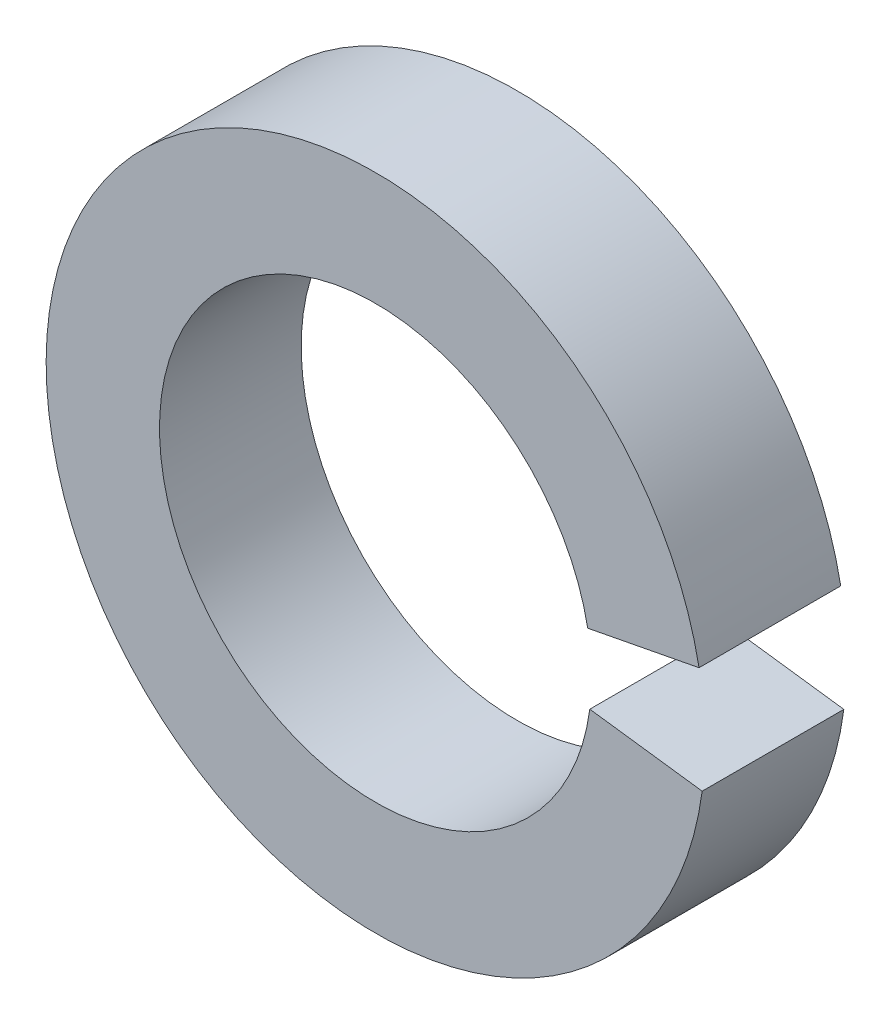
ISO-10303-21;
HEADER;
FILE_DESCRIPTION(('STEP AP214'),'2;1');
FILE_NAME('part.step','',(''),(''),'','','');
FILE_SCHEMA(('AUTOMOTIVE_DESIGN { 1 0 10303 214 1 1 1 1 }'));
ENDSEC;
DATA;
#1=APPLICATION_CONTEXT('core data for automotive mechanical design processes');
#2=APPLICATION_PROTOCOL_DEFINITION('international standard','automotive_design',2000,#1);
#3=PRODUCT_CONTEXT('',#1,'mechanical');
#4=PRODUCT('Part','Part','',(#3));
#5=PRODUCT_RELATED_PRODUCT_CATEGORY('part','',(#4));
#6=PRODUCT_DEFINITION_FORMATION('','',#4);
#7=PRODUCT_DEFINITION_CONTEXT('part definition',#1,'design');
#8=PRODUCT_DEFINITION('design','',#6,#7);
#9=PRODUCT_DEFINITION_SHAPE('','',#8);
#10=(LENGTH_UNIT() NAMED_UNIT(*) SI_UNIT(.MILLI.,.METRE.));
#11=(NAMED_UNIT(*) PLANE_ANGLE_UNIT() SI_UNIT($,.RADIAN.));
#12=(NAMED_UNIT(*) SI_UNIT($,.STERADIAN.) SOLID_ANGLE_UNIT());
#13=UNCERTAINTY_MEASURE_WITH_UNIT(LENGTH_MEASURE(1.E-05),#10,'distance_accuracy_value','');
#14=(GEOMETRIC_REPRESENTATION_CONTEXT(3) GLOBAL_UNCERTAINTY_ASSIGNED_CONTEXT((#13)) GLOBAL_UNIT_ASSIGNED_CONTEXT((#10,
#11,#12)) REPRESENTATION_CONTEXT('',''));
#15=CARTESIAN_POINT('',(0.,0.,0.));
#16=DIRECTION('',(0.,0.,1.));
#17=DIRECTION('',(1.,0.,0.));
#18=AXIS2_PLACEMENT_3D('',#15,#16,#17);
#19=CARTESIAN_POINT('',(0.,0.,2.));
#20=DIRECTION('',(0.,0.,-1.));
#21=DIRECTION('',(-1.,0.,0.));
#22=AXIS2_PLACEMENT_3D('',#19,#20,#21);
#23=CYLINDRICAL_SURFACE('',#22,3.05);
#24=CARTESIAN_POINT('',(0.,0.,0.));
#25=DIRECTION('',(0.,0.,-1.));
#26=DIRECTION('',(1.,0.,0.));
#27=AXIS2_PLACEMENT_3D('',#24,#25,#26);
#28=CIRCLE('',#27,3.05);
#29=CARTESIAN_POINT('',(3.02384323329183,-0.398587632115206,0.));
#30=VERTEX_POINT('',#29);
#31=CARTESIAN_POINT('',(2.99498014845336,0.576709554602892,0.));
#32=VERTEX_POINT('',#31);
#33=EDGE_CURVE('E97',#30,#32,#28,.T.);
#34=ORIENTED_EDGE('',*,*,#33,.T.);
#35=DIRECTION('',(0.,0.,-1.));
#36=VECTOR('',#35,1.);
#37=CARTESIAN_POINT('',(2.99498014845336,0.576709554602892,2.));
#38=LINE('',#37,#36);
#39=CARTESIAN_POINT('',(2.99498014845336,0.576709554602892,2.));
#40=VERTEX_POINT('',#39);
#41=EDGE_CURVE('E11',#40,#32,#38,.T.);
#42=ORIENTED_EDGE('',*,*,#41,.F.);
#43=CARTESIAN_POINT('',(0.,0.,2.));
#44=DIRECTION('',(0.,0.,-1.));
#45=DIRECTION('',(1.,0.,0.));
#46=AXIS2_PLACEMENT_3D('',#43,#44,#45);
#47=CIRCLE('',#46,3.05);
#48=CARTESIAN_POINT('',(3.02384323329183,-0.398587632115206,2.));
#49=VERTEX_POINT('',#48);
#50=EDGE_CURVE('E85',#49,#40,#47,.T.);
#51=ORIENTED_EDGE('',*,*,#50,.F.);
#52=DIRECTION('',(0.,0.,-1.));
#53=VECTOR('',#52,1.);
#54=CARTESIAN_POINT('',(3.02384323329183,-0.398587632115206,2.));
#55=LINE('',#54,#53);
#56=EDGE_CURVE('E93',#49,#30,#55,.T.);
#57=ORIENTED_EDGE('',*,*,#56,.T.);
#58=EDGE_LOOP('',(#34,#42,#51,#57));
#59=FACE_BOUND('',#58,.T.);
#60=ADVANCED_FACE('F34',(#59),#23,.F.);
#61=CARTESIAN_POINT('',(2.99498014845336,0.576709554602892,2.));
#62=DIRECTION('',(-0.189085099869801,0.981960704410939,0.));
#63=DIRECTION('',(-0.981960704410939,-0.189085099869801,0.));
#64=AXIS2_PLACEMENT_3D('',#61,#62,#63);
#65=PLANE('',#64);
#66=DIRECTION('',(0.981960704410939,0.189085099869801,0.));
#67=VECTOR('',#66,1.);
#68=CARTESIAN_POINT('',(2.99498014845336,0.576709554602892,0.));
#69=LINE('',#68,#67);
#70=CARTESIAN_POINT('',(4.56611727551087,0.879245714394574,0.));
#71=VERTEX_POINT('',#70);
#72=EDGE_CURVE('E89',#32,#71,#69,.T.);
#73=ORIENTED_EDGE('',*,*,#72,.T.);
#74=DIRECTION('',(0.,0.,-1.));
#75=VECTOR('',#74,1.);
#76=CARTESIAN_POINT('',(4.56611727551087,0.879245714394574,2.));
#77=LINE('',#76,#75);
#78=CARTESIAN_POINT('',(4.56611727551087,0.879245714394574,2.));
#79=VERTEX_POINT('',#78);
#80=EDGE_CURVE('E42',#79,#71,#77,.T.);
#81=ORIENTED_EDGE('',*,*,#80,.F.);
#82=DIRECTION('',(0.981960704410939,0.189085099869801,0.));
#83=VECTOR('',#82,1.);
#84=CARTESIAN_POINT('',(2.99498014845336,0.576709554602892,2.));
#85=LINE('',#84,#83);
#86=EDGE_CURVE('E80',#40,#79,#85,.T.);
#87=ORIENTED_EDGE('',*,*,#86,.F.);
#88=ORIENTED_EDGE('',*,*,#41,.T.);
#89=EDGE_LOOP('',(#73,#81,#87,#88));
#90=FACE_BOUND('',#89,.T.);
#91=ADVANCED_FACE('F88',(#90),#65,.F.);
#92=CARTESIAN_POINT('',(0.,0.,2.));
#93=DIRECTION('',(0.,0.,-1.));
#94=DIRECTION('',(-1.,0.,0.));
#95=AXIS2_PLACEMENT_3D('',#92,#93,#94);
#96=CYLINDRICAL_SURFACE('',#95,4.65);
#97=CARTESIAN_POINT('',(0.,0.,0.));
#98=DIRECTION('',(0.,0.,1.));
#99=DIRECTION('',(1.,0.,0.));
#100=AXIS2_PLACEMENT_3D('',#97,#98,#99);
#101=CIRCLE('',#100,4.65);
#102=CARTESIAN_POINT('',(4.6101216507564,-0.607682783388757,0.));
#103=VERTEX_POINT('',#102);
#104=EDGE_CURVE('E67',#71,#103,#101,.T.);
#105=ORIENTED_EDGE('',*,*,#104,.T.);
#106=DIRECTION('',(0.,0.,-1.));
#107=VECTOR('',#106,1.);
#108=CARTESIAN_POINT('',(4.6101216507564,-0.607682783388757,2.));
#109=LINE('',#108,#107);
#110=CARTESIAN_POINT('',(4.6101216507564,-0.607682783388757,2.));
#111=VERTEX_POINT('',#110);
#112=EDGE_CURVE('E90',#111,#103,#109,.T.);
#113=ORIENTED_EDGE('',*,*,#112,.F.);
#114=CARTESIAN_POINT('',(0.,0.,2.));
#115=DIRECTION('',(0.,0.,1.));
#116=DIRECTION('',(1.,0.,0.));
#117=AXIS2_PLACEMENT_3D('',#114,#115,#116);
#118=CIRCLE('',#117,4.65);
#119=EDGE_CURVE('E83',#79,#111,#118,.T.);
#120=ORIENTED_EDGE('',*,*,#119,.F.);
#121=ORIENTED_EDGE('',*,*,#80,.T.);
#122=EDGE_LOOP('',(#105,#113,#120,#121));
#123=FACE_BOUND('',#122,.T.);
#124=ADVANCED_FACE('F91',(#123),#96,.T.);
#125=CARTESIAN_POINT('',(3.02384323329183,-0.398587632115206,2.));
#126=DIRECTION('',(-0.130684469545969,-0.991424010915354,0.));
#127=DIRECTION('',(0.991424010915354,-0.130684469545969,0.));
#128=AXIS2_PLACEMENT_3D('',#125,#126,#127);
#129=PLANE('',#128);
#130=DIRECTION('',(-0.991424010915354,0.130684469545969,0.));
#131=VECTOR('',#130,1.);
#132=CARTESIAN_POINT('',(3.02384323329183,-0.398587632115206,0.));
#133=LINE('',#132,#131);
#134=EDGE_CURVE('E73',#103,#30,#133,.T.);
#135=ORIENTED_EDGE('',*,*,#134,.T.);
#136=ORIENTED_EDGE('',*,*,#56,.F.);
#137=DIRECTION('',(-0.991424010915354,0.130684469545969,0.));
#138=VECTOR('',#137,1.);
#139=CARTESIAN_POINT('',(3.02384323329183,-0.398587632115206,2.));
#140=LINE('',#139,#138);
#141=EDGE_CURVE('E50',#111,#49,#140,.T.);
#142=ORIENTED_EDGE('',*,*,#141,.F.);
#143=ORIENTED_EDGE('',*,*,#112,.T.);
#144=EDGE_LOOP('',(#135,#136,#142,#143));
#145=FACE_BOUND('',#144,.T.);
#146=ADVANCED_FACE('F104',(#145),#129,.F.);
#147=CARTESIAN_POINT('',(0.,0.,2.));
#148=DIRECTION('',(0.,0.,1.));
#149=DIRECTION('',(1.,0.,0.));
#150=AXIS2_PLACEMENT_3D('',#147,#148,#149);
#151=PLANE('',#150);
#152=ORIENTED_EDGE('',*,*,#50,.T.);
#153=ORIENTED_EDGE('',*,*,#86,.T.);
#154=ORIENTED_EDGE('',*,*,#119,.T.);
#155=ORIENTED_EDGE('',*,*,#141,.T.);
#156=EDGE_LOOP('',(#152,#153,#154,#155));
#157=FACE_BOUND('',#156,.T.);
#158=ADVANCED_FACE('F81',(#157),#151,.T.);
#159=CARTESIAN_POINT('',(0.,0.,0.));
#160=DIRECTION('',(0.,0.,1.));
#161=DIRECTION('',(1.,0.,0.));
#162=AXIS2_PLACEMENT_3D('',#159,#160,#161);
#163=PLANE('',#162);
#164=ORIENTED_EDGE('',*,*,#33,.F.);
#165=ORIENTED_EDGE('',*,*,#134,.F.);
#166=ORIENTED_EDGE('',*,*,#104,.F.);
#167=ORIENTED_EDGE('',*,*,#72,.F.);
#168=EDGE_LOOP('',(#164,#165,#166,#167));
#169=FACE_BOUND('',#168,.T.);
#170=ADVANCED_FACE('F107',(#169),#163,.F.);
#171=CLOSED_SHELL('',(#60,#91,#124,#146,#158,#170));
#172=MANIFOLD_SOLID_BREP('B2',#171);
#173=ADVANCED_BREP_SHAPE_REPRESENTATION('',(#18,#172),#14);
#174=SHAPE_DEFINITION_REPRESENTATION(#9,#173);
ENDSEC;
END-ISO-10303-21;
